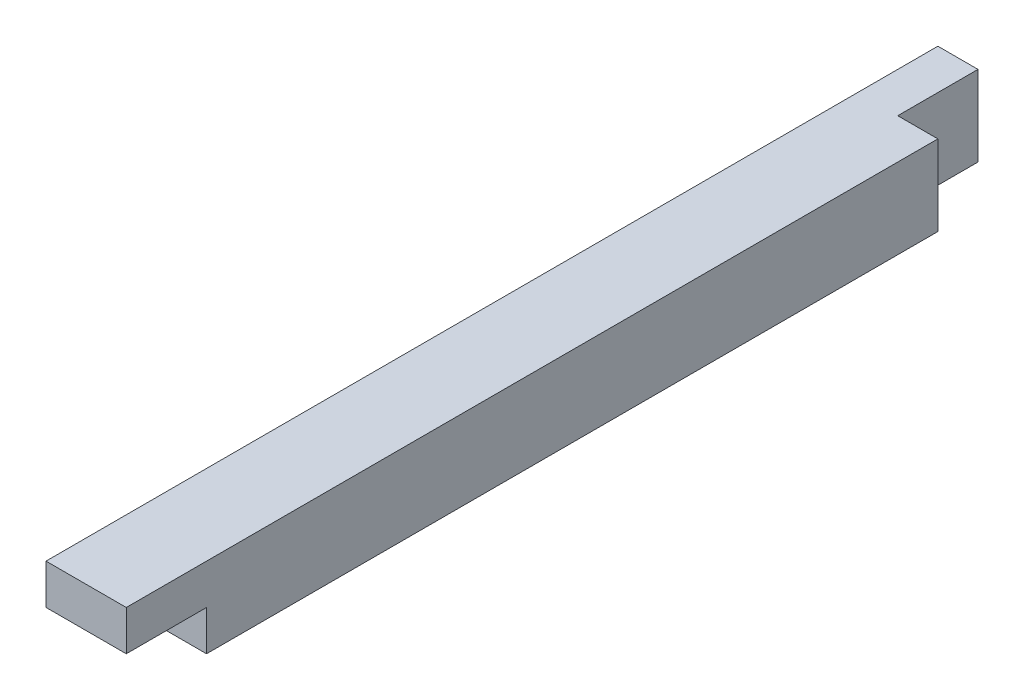
ISO-10303-21;
HEADER;
FILE_DESCRIPTION(('STEP AP214'),'2;1');
FILE_NAME('part.step','',(''),(''),'','','');
FILE_SCHEMA(('AUTOMOTIVE_DESIGN { 1 0 10303 214 1 1 1 1 }'));
ENDSEC;
DATA;
#1=APPLICATION_CONTEXT('core data for automotive mechanical design processes');
#2=APPLICATION_PROTOCOL_DEFINITION('international standard','automotive_design',2000,#1);
#3=PRODUCT_CONTEXT('',#1,'mechanical');
#4=PRODUCT('Part','Part','',(#3));
#5=PRODUCT_RELATED_PRODUCT_CATEGORY('part','',(#4));
#6=PRODUCT_DEFINITION_FORMATION('','',#4);
#7=PRODUCT_DEFINITION_CONTEXT('part definition',#1,'design');
#8=PRODUCT_DEFINITION('design','',#6,#7);
#9=PRODUCT_DEFINITION_SHAPE('','',#8);
#10=(LENGTH_UNIT() NAMED_UNIT(*) SI_UNIT(.MILLI.,.METRE.));
#11=(NAMED_UNIT(*) PLANE_ANGLE_UNIT() SI_UNIT($,.RADIAN.));
#12=(NAMED_UNIT(*) SI_UNIT($,.STERADIAN.) SOLID_ANGLE_UNIT());
#13=UNCERTAINTY_MEASURE_WITH_UNIT(LENGTH_MEASURE(1.E-05),#10,'distance_accuracy_value','');
#14=(GEOMETRIC_REPRESENTATION_CONTEXT(3) GLOBAL_UNCERTAINTY_ASSIGNED_CONTEXT((#13)) GLOBAL_UNIT_ASSIGNED_CONTEXT((#10,
#11,#12)) REPRESENTATION_CONTEXT('',''));
#15=CARTESIAN_POINT('',(0.,0.,0.));
#16=DIRECTION('',(0.,0.,1.));
#17=DIRECTION('',(1.,0.,0.));
#18=AXIS2_PLACEMENT_3D('',#15,#16,#17);
#19=CARTESIAN_POINT('',(0.,0.,1000.));
#20=DIRECTION('',(0.,0.,-1.));
#21=DIRECTION('',(-1.,0.,0.));
#22=AXIS2_PLACEMENT_3D('',#19,#20,#21);
#23=PLANE('',#22);
#24=DIRECTION('',(-1.,0.,0.));
#25=VECTOR('',#24,1.);
#26=CARTESIAN_POINT('',(0.,45.,1000.));
#27=LINE('',#26,#25);
#28=CARTESIAN_POINT('',(90.,45.,1000.));
#29=VERTEX_POINT('',#28);
#30=CARTESIAN_POINT('',(0.,45.,1000.));
#31=VERTEX_POINT('',#30);
#32=EDGE_CURVE('E162',#29,#31,#27,.T.);
#33=ORIENTED_EDGE('',*,*,#32,.F.);
#34=DIRECTION('',(0.,1.,0.));
#35=VECTOR('',#34,1.);
#36=CARTESIAN_POINT('',(90.,0.,1000.));
#37=LINE('',#36,#35);
#38=CARTESIAN_POINT('',(90.,90.,1000.));
#39=VERTEX_POINT('',#38);
#40=EDGE_CURVE('E125',#29,#39,#37,.T.);
#41=ORIENTED_EDGE('',*,*,#40,.T.);
#42=DIRECTION('',(-1.,0.,0.));
#43=VECTOR('',#42,1.);
#44=CARTESIAN_POINT('',(0.,90.,1000.));
#45=LINE('',#44,#43);
#46=CARTESIAN_POINT('',(0.,90.,1000.));
#47=VERTEX_POINT('',#46);
#48=EDGE_CURVE('E133',#39,#47,#45,.T.);
#49=ORIENTED_EDGE('',*,*,#48,.T.);
#50=DIRECTION('',(0.,-1.,0.));
#51=VECTOR('',#50,1.);
#52=CARTESIAN_POINT('',(0.,0.,1000.));
#53=LINE('',#52,#51);
#54=EDGE_CURVE('E121',#47,#31,#53,.T.);
#55=ORIENTED_EDGE('',*,*,#54,.T.);
#56=EDGE_LOOP('',(#33,#41,#49,#55));
#57=FACE_BOUND('',#56,.T.);
#58=ADVANCED_FACE('F33',(#57),#23,.F.);
#59=CARTESIAN_POINT('',(0.,0.,1000.));
#60=DIRECTION('',(1.,0.,0.));
#61=DIRECTION('',(0.,1.,0.));
#62=AXIS2_PLACEMENT_3D('',#59,#60,#61);
#63=PLANE('',#62);
#64=DIRECTION('',(0.,0.,-1.));
#65=VECTOR('',#64,1.);
#66=CARTESIAN_POINT('',(0.,0.,1000.));
#67=LINE('',#66,#65);
#68=CARTESIAN_POINT('',(0.,0.,910.));
#69=VERTEX_POINT('',#68);
#70=CARTESIAN_POINT('',(0.,0.,0.));
#71=VERTEX_POINT('',#70);
#72=EDGE_CURVE('E11',#69,#71,#67,.T.);
#73=ORIENTED_EDGE('',*,*,#72,.F.);
#74=DIRECTION('',(0.,-1.,0.));
#75=VECTOR('',#74,1.);
#76=CARTESIAN_POINT('',(0.,45.,910.));
#77=LINE('',#76,#75);
#78=CARTESIAN_POINT('',(0.,45.,910.));
#79=VERTEX_POINT('',#78);
#80=EDGE_CURVE('E163',#79,#69,#77,.T.);
#81=ORIENTED_EDGE('',*,*,#80,.F.);
#82=DIRECTION('',(0.,0.,-1.));
#83=VECTOR('',#82,1.);
#84=CARTESIAN_POINT('',(0.,45.,1000.));
#85=LINE('',#84,#83);
#86=EDGE_CURVE('E151',#31,#79,#85,.T.);
#87=ORIENTED_EDGE('',*,*,#86,.F.);
#88=ORIENTED_EDGE('',*,*,#54,.F.);
#89=DIRECTION('',(0.,0.,-1.));
#90=VECTOR('',#89,1.);
#91=CARTESIAN_POINT('',(0.,90.,1000.));
#92=LINE('',#91,#90);
#93=CARTESIAN_POINT('',(0.,90.,0.));
#94=VERTEX_POINT('',#93);
#95=EDGE_CURVE('E130',#47,#94,#92,.T.);
#96=ORIENTED_EDGE('',*,*,#95,.T.);
#97=DIRECTION('',(0.,-1.,0.));
#98=VECTOR('',#97,1.);
#99=CARTESIAN_POINT('',(0.,0.,0.));
#100=LINE('',#99,#98);
#101=EDGE_CURVE('E120',#94,#71,#100,.T.);
#102=ORIENTED_EDGE('',*,*,#101,.T.);
#103=EDGE_LOOP('',(#73,#81,#87,#88,#96,#102));
#104=FACE_BOUND('',#103,.T.);
#105=ADVANCED_FACE('F35',(#104),#63,.F.);
#106=CARTESIAN_POINT('',(0.,0.,1000.));
#107=DIRECTION('',(0.,1.,0.));
#108=DIRECTION('',(0.,0.,1.));
#109=AXIS2_PLACEMENT_3D('',#106,#107,#108);
#110=PLANE('',#109);
#111=DIRECTION('',(0.,0.,-1.));
#112=VECTOR('',#111,1.);
#113=CARTESIAN_POINT('',(45.,0.,0.));
#114=LINE('',#113,#112);
#115=CARTESIAN_POINT('',(45.,0.,90.));
#116=VERTEX_POINT('',#115);
#117=CARTESIAN_POINT('',(45.,0.,0.));
#118=VERTEX_POINT('',#117);
#119=EDGE_CURVE('E48',#116,#118,#114,.T.);
#120=ORIENTED_EDGE('',*,*,#119,.F.);
#121=DIRECTION('',(1.,0.,0.));
#122=VECTOR('',#121,1.);
#123=CARTESIAN_POINT('',(45.,0.,90.));
#124=LINE('',#123,#122);
#125=CARTESIAN_POINT('',(90.,0.,90.));
#126=VERTEX_POINT('',#125);
#127=EDGE_CURVE('E148',#116,#126,#124,.T.);
#128=ORIENTED_EDGE('',*,*,#127,.T.);
#129=DIRECTION('',(0.,0.,-1.));
#130=VECTOR('',#129,1.);
#131=CARTESIAN_POINT('',(90.,0.,1000.));
#132=LINE('',#131,#130);
#133=CARTESIAN_POINT('',(90.,0.,910.));
#134=VERTEX_POINT('',#133);
#135=EDGE_CURVE('E41',#134,#126,#132,.T.);
#136=ORIENTED_EDGE('',*,*,#135,.F.);
#137=DIRECTION('',(1.,0.,0.));
#138=VECTOR('',#137,1.);
#139=CARTESIAN_POINT('',(0.,0.,910.));
#140=LINE('',#139,#138);
#141=EDGE_CURVE('E146',#69,#134,#140,.T.);
#142=ORIENTED_EDGE('',*,*,#141,.F.);
#143=ORIENTED_EDGE('',*,*,#72,.T.);
#144=DIRECTION('',(1.,0.,0.));
#145=VECTOR('',#144,1.);
#146=CARTESIAN_POINT('',(0.,0.,0.));
#147=LINE('',#146,#145);
#148=EDGE_CURVE('E122',#71,#118,#147,.T.);
#149=ORIENTED_EDGE('',*,*,#148,.T.);
#150=EDGE_LOOP('',(#120,#128,#136,#142,#143,#149));
#151=FACE_BOUND('',#150,.T.);
#152=ADVANCED_FACE('F145',(#151),#110,.F.);
#153=CARTESIAN_POINT('',(90.,0.,1000.));
#154=DIRECTION('',(-1.,0.,0.));
#155=DIRECTION('',(0.,-1.,0.));
#156=AXIS2_PLACEMENT_3D('',#153,#154,#155);
#157=PLANE('',#156);
#158=ORIENTED_EDGE('',*,*,#135,.T.);
#159=DIRECTION('',(0.,-1.,0.));
#160=VECTOR('',#159,1.);
#161=CARTESIAN_POINT('',(90.,90.,90.));
#162=LINE('',#161,#160);
#163=CARTESIAN_POINT('',(90.,90.,90.));
#164=VERTEX_POINT('',#163);
#165=EDGE_CURVE('E106',#164,#126,#162,.T.);
#166=ORIENTED_EDGE('',*,*,#165,.F.);
#167=DIRECTION('',(0.,0.,-1.));
#168=VECTOR('',#167,1.);
#169=CARTESIAN_POINT('',(90.,90.,1000.));
#170=LINE('',#169,#168);
#171=EDGE_CURVE('E132',#39,#164,#170,.T.);
#172=ORIENTED_EDGE('',*,*,#171,.F.);
#173=ORIENTED_EDGE('',*,*,#40,.F.);
#174=DIRECTION('',(0.,0.,1.));
#175=VECTOR('',#174,1.);
#176=CARTESIAN_POINT('',(90.,45.,1000.));
#177=LINE('',#176,#175);
#178=CARTESIAN_POINT('',(90.,45.,910.));
#179=VERTEX_POINT('',#178);
#180=EDGE_CURVE('E56',#179,#29,#177,.T.);
#181=ORIENTED_EDGE('',*,*,#180,.F.);
#182=DIRECTION('',(0.,-1.,0.));
#183=VECTOR('',#182,1.);
#184=CARTESIAN_POINT('',(90.,45.,910.));
#185=LINE('',#184,#183);
#186=EDGE_CURVE('E141',#179,#134,#185,.T.);
#187=ORIENTED_EDGE('',*,*,#186,.T.);
#188=EDGE_LOOP('',(#158,#166,#172,#173,#181,#187));
#189=FACE_BOUND('',#188,.T.);
#190=ADVANCED_FACE('F139',(#189),#157,.F.);
#191=CARTESIAN_POINT('',(0.,90.,1000.));
#192=DIRECTION('',(0.,-1.,0.));
#193=DIRECTION('',(0.,0.,-1.));
#194=AXIS2_PLACEMENT_3D('',#191,#192,#193);
#195=PLANE('',#194);
#196=ORIENTED_EDGE('',*,*,#171,.T.);
#197=DIRECTION('',(1.,0.,0.));
#198=VECTOR('',#197,1.);
#199=CARTESIAN_POINT('',(45.,90.,90.));
#200=LINE('',#199,#198);
#201=CARTESIAN_POINT('',(45.,90.,90.));
#202=VERTEX_POINT('',#201);
#203=EDGE_CURVE('E114',#202,#164,#200,.T.);
#204=ORIENTED_EDGE('',*,*,#203,.F.);
#205=DIRECTION('',(0.,0.,1.));
#206=VECTOR('',#205,1.);
#207=CARTESIAN_POINT('',(45.,90.,0.));
#208=LINE('',#207,#206);
#209=CARTESIAN_POINT('',(45.,90.,0.));
#210=VERTEX_POINT('',#209);
#211=EDGE_CURVE('E100',#210,#202,#208,.T.);
#212=ORIENTED_EDGE('',*,*,#211,.F.);
#213=DIRECTION('',(-1.,0.,0.));
#214=VECTOR('',#213,1.);
#215=CARTESIAN_POINT('',(0.,90.,0.));
#216=LINE('',#215,#214);
#217=EDGE_CURVE('E112',#210,#94,#216,.T.);
#218=ORIENTED_EDGE('',*,*,#217,.T.);
#219=ORIENTED_EDGE('',*,*,#95,.F.);
#220=ORIENTED_EDGE('',*,*,#48,.F.);
#221=EDGE_LOOP('',(#196,#204,#212,#218,#219,#220));
#222=FACE_BOUND('',#221,.T.);
#223=ADVANCED_FACE('F110',(#222),#195,.F.);
#224=CARTESIAN_POINT('',(0.,0.,0.));
#225=DIRECTION('',(0.,0.,-1.));
#226=DIRECTION('',(-1.,0.,0.));
#227=AXIS2_PLACEMENT_3D('',#224,#225,#226);
#228=PLANE('',#227);
#229=DIRECTION('',(0.,1.,0.));
#230=VECTOR('',#229,1.);
#231=CARTESIAN_POINT('',(45.,90.,0.));
#232=LINE('',#231,#230);
#233=EDGE_CURVE('E97',#118,#210,#232,.T.);
#234=ORIENTED_EDGE('',*,*,#233,.F.);
#235=ORIENTED_EDGE('',*,*,#148,.F.);
#236=ORIENTED_EDGE('',*,*,#101,.F.);
#237=ORIENTED_EDGE('',*,*,#217,.F.);
#238=EDGE_LOOP('',(#234,#235,#236,#237));
#239=FACE_BOUND('',#238,.T.);
#240=ADVANCED_FACE('F118',(#239),#228,.T.);
#241=CARTESIAN_POINT('',(0.,45.,910.));
#242=DIRECTION('',(0.,0.,-1.));
#243=DIRECTION('',(-1.,0.,0.));
#244=AXIS2_PLACEMENT_3D('',#241,#242,#243);
#245=PLANE('',#244);
#246=ORIENTED_EDGE('',*,*,#141,.T.);
#247=ORIENTED_EDGE('',*,*,#186,.F.);
#248=DIRECTION('',(1.,0.,0.));
#249=VECTOR('',#248,1.);
#250=CARTESIAN_POINT('',(0.,45.,910.));
#251=LINE('',#250,#249);
#252=EDGE_CURVE('E159',#79,#179,#251,.T.);
#253=ORIENTED_EDGE('',*,*,#252,.F.);
#254=ORIENTED_EDGE('',*,*,#80,.T.);
#255=EDGE_LOOP('',(#246,#247,#253,#254));
#256=FACE_BOUND('',#255,.T.);
#257=ADVANCED_FACE('F177',(#256),#245,.F.);
#258=CARTESIAN_POINT('',(0.,45.,0.));
#259=DIRECTION('',(0.,-1.,0.));
#260=DIRECTION('',(0.,0.,-1.));
#261=AXIS2_PLACEMENT_3D('',#258,#259,#260);
#262=PLANE('',#261);
#263=ORIENTED_EDGE('',*,*,#86,.T.);
#264=ORIENTED_EDGE('',*,*,#252,.T.);
#265=ORIENTED_EDGE('',*,*,#180,.T.);
#266=ORIENTED_EDGE('',*,*,#32,.T.);
#267=EDGE_LOOP('',(#263,#264,#265,#266));
#268=FACE_BOUND('',#267,.T.);
#269=ADVANCED_FACE('F175',(#268),#262,.T.);
#270=CARTESIAN_POINT('',(45.,90.,90.));
#271=DIRECTION('',(0.,0.,1.));
#272=DIRECTION('',(0.,-1.,0.));
#273=AXIS2_PLACEMENT_3D('',#270,#271,#272);
#274=PLANE('',#273);
#275=ORIENTED_EDGE('',*,*,#165,.T.);
#276=ORIENTED_EDGE('',*,*,#127,.F.);
#277=DIRECTION('',(0.,-1.,0.));
#278=VECTOR('',#277,1.);
#279=CARTESIAN_POINT('',(45.,90.,90.));
#280=LINE('',#279,#278);
#281=EDGE_CURVE('E115',#202,#116,#280,.T.);
#282=ORIENTED_EDGE('',*,*,#281,.F.);
#283=ORIENTED_EDGE('',*,*,#203,.T.);
#284=EDGE_LOOP('',(#275,#276,#282,#283));
#285=FACE_BOUND('',#284,.T.);
#286=ADVANCED_FACE('F184',(#285),#274,.F.);
#287=CARTESIAN_POINT('',(45.,0.,0.));
#288=DIRECTION('',(-1.,0.,0.));
#289=DIRECTION('',(0.,-1.,0.));
#290=AXIS2_PLACEMENT_3D('',#287,#288,#289);
#291=PLANE('',#290);
#292=ORIENTED_EDGE('',*,*,#233,.T.);
#293=ORIENTED_EDGE('',*,*,#211,.T.);
#294=ORIENTED_EDGE('',*,*,#281,.T.);
#295=ORIENTED_EDGE('',*,*,#119,.T.);
#296=EDGE_LOOP('',(#292,#293,#294,#295));
#297=FACE_BOUND('',#296,.T.);
#298=ADVANCED_FACE('F99',(#297),#291,.F.);
#299=CLOSED_SHELL('',(#58,#105,#152,#190,#223,#240,#257,#269,#286,#298));
#300=MANIFOLD_SOLID_BREP('B2',#299);
#301=ADVANCED_BREP_SHAPE_REPRESENTATION('',(#18,#300),#14);
#302=SHAPE_DEFINITION_REPRESENTATION(#9,#301);
ENDSEC;
END-ISO-10303-21;
